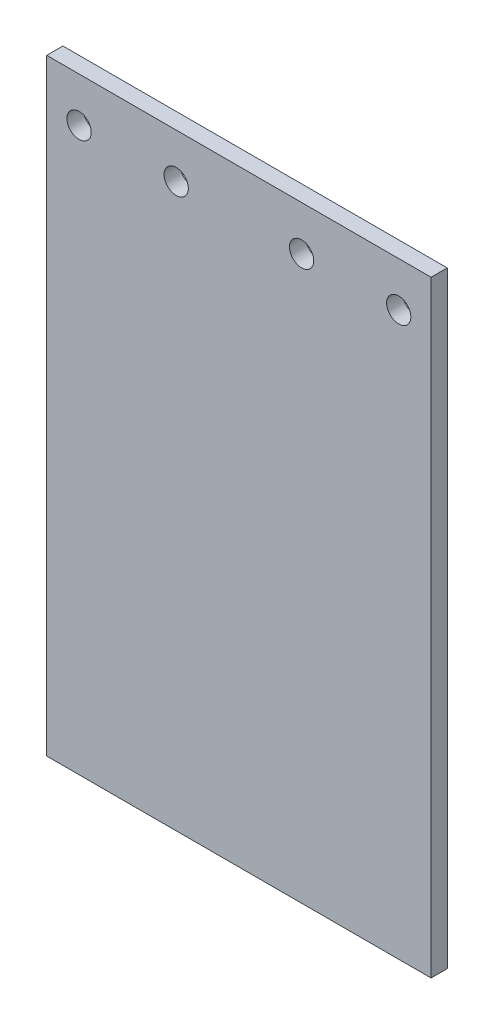
ISO-10303-21;
HEADER;
FILE_DESCRIPTION(('STEP AP214'),'2;1');
FILE_NAME('part.step','',(''),(''),'','','');
FILE_SCHEMA(('AUTOMOTIVE_DESIGN { 1 0 10303 214 1 1 1 1 }'));
ENDSEC;
DATA;
#1=APPLICATION_CONTEXT('core data for automotive mechanical design processes');
#2=APPLICATION_PROTOCOL_DEFINITION('international standard','automotive_design',2000,#1);
#3=PRODUCT_CONTEXT('',#1,'mechanical');
#4=PRODUCT('Part','Part','',(#3));
#5=PRODUCT_RELATED_PRODUCT_CATEGORY('part','',(#4));
#6=PRODUCT_DEFINITION_FORMATION('','',#4);
#7=PRODUCT_DEFINITION_CONTEXT('part definition',#1,'design');
#8=PRODUCT_DEFINITION('design','',#6,#7);
#9=PRODUCT_DEFINITION_SHAPE('','',#8);
#10=(LENGTH_UNIT() NAMED_UNIT(*) SI_UNIT(.MILLI.,.METRE.));
#11=(NAMED_UNIT(*) PLANE_ANGLE_UNIT() SI_UNIT($,.RADIAN.));
#12=(NAMED_UNIT(*) SI_UNIT($,.STERADIAN.) SOLID_ANGLE_UNIT());
#13=UNCERTAINTY_MEASURE_WITH_UNIT(LENGTH_MEASURE(1.E-05),#10,'distance_accuracy_value','');
#14=(GEOMETRIC_REPRESENTATION_CONTEXT(3) GLOBAL_UNCERTAINTY_ASSIGNED_CONTEXT((#13)) GLOBAL_UNIT_ASSIGNED_CONTEXT((#10,
#11,#12)) REPRESENTATION_CONTEXT('',''));
#15=CARTESIAN_POINT('',(0.,0.,0.));
#16=DIRECTION('',(0.,0.,1.));
#17=DIRECTION('',(1.,0.,0.));
#18=AXIS2_PLACEMENT_3D('',#15,#16,#17);
#19=CARTESIAN_POINT('',(47.5,-75.,4.));
#20=DIRECTION('',(-1.,0.,0.));
#21=DIRECTION('',(0.,0.,1.));
#22=AXIS2_PLACEMENT_3D('',#19,#20,#21);
#23=PLANE('',#22);
#24=DIRECTION('',(0.,1.,0.));
#25=VECTOR('',#24,1.);
#26=CARTESIAN_POINT('',(47.5,-75.,0.));
#27=LINE('',#26,#25);
#28=CARTESIAN_POINT('',(47.5,-75.,0.));
#29=VERTEX_POINT('',#28);
#30=CARTESIAN_POINT('',(47.5,75.,0.));
#31=VERTEX_POINT('',#30);
#32=EDGE_CURVE('E100',#29,#31,#27,.T.);
#33=ORIENTED_EDGE('',*,*,#32,.T.);
#34=DIRECTION('',(0.,0.,-1.));
#35=VECTOR('',#34,1.);
#36=CARTESIAN_POINT('',(47.5,75.,4.));
#37=LINE('',#36,#35);
#38=CARTESIAN_POINT('',(47.5,75.,4.));
#39=VERTEX_POINT('',#38);
#40=EDGE_CURVE('E11',#39,#31,#37,.T.);
#41=ORIENTED_EDGE('',*,*,#40,.F.);
#42=DIRECTION('',(0.,1.,0.));
#43=VECTOR('',#42,1.);
#44=CARTESIAN_POINT('',(47.5,-75.,4.));
#45=LINE('',#44,#43);
#46=CARTESIAN_POINT('',(47.5,-75.,4.));
#47=VERTEX_POINT('',#46);
#48=EDGE_CURVE('E88',#47,#39,#45,.T.);
#49=ORIENTED_EDGE('',*,*,#48,.F.);
#50=DIRECTION('',(0.,0.,-1.));
#51=VECTOR('',#50,1.);
#52=CARTESIAN_POINT('',(47.5,-75.,4.));
#53=LINE('',#52,#51);
#54=EDGE_CURVE('E96',#47,#29,#53,.T.);
#55=ORIENTED_EDGE('',*,*,#54,.T.);
#56=EDGE_LOOP('',(#33,#41,#49,#55));
#57=FACE_BOUND('',#56,.T.);
#58=ADVANCED_FACE('F37',(#57),#23,.F.);
#59=CARTESIAN_POINT('',(-47.5,75.,4.));
#60=DIRECTION('',(0.,-1.,0.));
#61=DIRECTION('',(0.,0.,-1.));
#62=AXIS2_PLACEMENT_3D('',#59,#60,#61);
#63=PLANE('',#62);
#64=DIRECTION('',(-1.,0.,0.));
#65=VECTOR('',#64,1.);
#66=CARTESIAN_POINT('',(-47.5,75.,0.));
#67=LINE('',#66,#65);
#68=CARTESIAN_POINT('',(-47.5,75.,0.));
#69=VERTEX_POINT('',#68);
#70=EDGE_CURVE('E92',#31,#69,#67,.T.);
#71=ORIENTED_EDGE('',*,*,#70,.T.);
#72=DIRECTION('',(0.,0.,-1.));
#73=VECTOR('',#72,1.);
#74=CARTESIAN_POINT('',(-47.5,75.,4.));
#75=LINE('',#74,#73);
#76=CARTESIAN_POINT('',(-47.5,75.,4.));
#77=VERTEX_POINT('',#76);
#78=EDGE_CURVE('E45',#77,#69,#75,.T.);
#79=ORIENTED_EDGE('',*,*,#78,.F.);
#80=DIRECTION('',(-1.,0.,0.));
#81=VECTOR('',#80,1.);
#82=CARTESIAN_POINT('',(-47.5,75.,4.));
#83=LINE('',#82,#81);
#84=EDGE_CURVE('E83',#39,#77,#83,.T.);
#85=ORIENTED_EDGE('',*,*,#84,.F.);
#86=ORIENTED_EDGE('',*,*,#40,.T.);
#87=EDGE_LOOP('',(#71,#79,#85,#86));
#88=FACE_BOUND('',#87,.T.);
#89=ADVANCED_FACE('F91',(#88),#63,.F.);
#90=CARTESIAN_POINT('',(-47.5,-75.,4.));
#91=DIRECTION('',(1.,0.,0.));
#92=DIRECTION('',(0.,0.,-1.));
#93=AXIS2_PLACEMENT_3D('',#90,#91,#92);
#94=PLANE('',#93);
#95=DIRECTION('',(0.,-1.,0.));
#96=VECTOR('',#95,1.);
#97=CARTESIAN_POINT('',(-47.5,-75.,0.));
#98=LINE('',#97,#96);
#99=CARTESIAN_POINT('',(-47.5,-75.,0.));
#100=VERTEX_POINT('',#99);
#101=EDGE_CURVE('E70',#69,#100,#98,.T.);
#102=ORIENTED_EDGE('',*,*,#101,.T.);
#103=DIRECTION('',(0.,0.,-1.));
#104=VECTOR('',#103,1.);
#105=CARTESIAN_POINT('',(-47.5,-75.,4.));
#106=LINE('',#105,#104);
#107=CARTESIAN_POINT('',(-47.5,-75.,4.));
#108=VERTEX_POINT('',#107);
#109=EDGE_CURVE('E93',#108,#100,#106,.T.);
#110=ORIENTED_EDGE('',*,*,#109,.F.);
#111=DIRECTION('',(0.,-1.,0.));
#112=VECTOR('',#111,1.);
#113=CARTESIAN_POINT('',(-47.5,-75.,4.));
#114=LINE('',#113,#112);
#115=EDGE_CURVE('E86',#77,#108,#114,.T.);
#116=ORIENTED_EDGE('',*,*,#115,.F.);
#117=ORIENTED_EDGE('',*,*,#78,.T.);
#118=EDGE_LOOP('',(#102,#110,#116,#117));
#119=FACE_BOUND('',#118,.T.);
#120=ADVANCED_FACE('F94',(#119),#94,.F.);
#121=CARTESIAN_POINT('',(-47.5,-75.,4.));
#122=DIRECTION('',(0.,1.,0.));
#123=DIRECTION('',(0.,0.,1.));
#124=AXIS2_PLACEMENT_3D('',#121,#122,#123);
#125=PLANE('',#124);
#126=DIRECTION('',(1.,0.,0.));
#127=VECTOR('',#126,1.);
#128=CARTESIAN_POINT('',(-47.5,-75.,0.));
#129=LINE('',#128,#127);
#130=EDGE_CURVE('E76',#100,#29,#129,.T.);
#131=ORIENTED_EDGE('',*,*,#130,.T.);
#132=ORIENTED_EDGE('',*,*,#54,.F.);
#133=DIRECTION('',(1.,0.,0.));
#134=VECTOR('',#133,1.);
#135=CARTESIAN_POINT('',(-47.5,-75.,4.));
#136=LINE('',#135,#134);
#137=EDGE_CURVE('E53',#108,#47,#136,.T.);
#138=ORIENTED_EDGE('',*,*,#137,.F.);
#139=ORIENTED_EDGE('',*,*,#109,.T.);
#140=EDGE_LOOP('',(#131,#132,#138,#139));
#141=FACE_BOUND('',#140,.T.);
#142=ADVANCED_FACE('F108',(#141),#125,.F.);
#143=CARTESIAN_POINT('',(0.,0.,4.));
#144=DIRECTION('',(0.,0.,-1.));
#145=DIRECTION('',(-1.,0.,0.));
#146=AXIS2_PLACEMENT_3D('',#143,#144,#145);
#147=PLANE('',#146);
#148=CARTESIAN_POINT('',(15.5,64.,4.));
#149=DIRECTION('',(0.,0.,-1.));
#150=DIRECTION('',(-1.,0.,0.));
#151=AXIS2_PLACEMENT_3D('',#148,#149,#150);
#152=CIRCLE('',#151,3.);
#153=CARTESIAN_POINT('',(12.5,64.,4.));
#154=VERTEX_POINT('',#153);
#155=EDGE_CURVE('E132',#154,#154,#152,.T.);
#156=ORIENTED_EDGE('',*,*,#155,.T.);
#157=EDGE_LOOP('',(#156));
#158=FACE_BOUND('',#157,.T.);
#159=CARTESIAN_POINT('',(39.5,64.,4.));
#160=DIRECTION('',(0.,0.,-1.));
#161=DIRECTION('',(-1.,0.,0.));
#162=AXIS2_PLACEMENT_3D('',#159,#160,#161);
#163=CIRCLE('',#162,3.);
#164=CARTESIAN_POINT('',(36.5,64.,4.));
#165=VERTEX_POINT('',#164);
#166=EDGE_CURVE('E126',#165,#165,#163,.T.);
#167=ORIENTED_EDGE('',*,*,#166,.T.);
#168=EDGE_LOOP('',(#167));
#169=FACE_BOUND('',#168,.T.);
#170=CARTESIAN_POINT('',(-15.5,64.,4.));
#171=DIRECTION('',(0.,0.,1.));
#172=DIRECTION('',(1.,0.,0.));
#173=AXIS2_PLACEMENT_3D('',#170,#171,#172);
#174=CIRCLE('',#173,3.);
#175=CARTESIAN_POINT('',(-12.5,64.,4.));
#176=VERTEX_POINT('',#175);
#177=EDGE_CURVE('E120',#176,#176,#174,.T.);
#178=ORIENTED_EDGE('',*,*,#177,.F.);
#179=EDGE_LOOP('',(#178));
#180=FACE_BOUND('',#179,.T.);
#181=CARTESIAN_POINT('',(-39.5,64.,4.));
#182=DIRECTION('',(0.,0.,1.));
#183=DIRECTION('',(1.,0.,0.));
#184=AXIS2_PLACEMENT_3D('',#181,#182,#183);
#185=CIRCLE('',#184,3.);
#186=CARTESIAN_POINT('',(-36.5,64.,4.));
#187=VERTEX_POINT('',#186);
#188=EDGE_CURVE('E114',#187,#187,#185,.T.);
#189=ORIENTED_EDGE('',*,*,#188,.F.);
#190=EDGE_LOOP('',(#189));
#191=FACE_BOUND('',#190,.T.);
#192=ORIENTED_EDGE('',*,*,#48,.T.);
#193=ORIENTED_EDGE('',*,*,#84,.T.);
#194=ORIENTED_EDGE('',*,*,#115,.T.);
#195=ORIENTED_EDGE('',*,*,#137,.T.);
#196=EDGE_LOOP('',(#192,#193,#194,#195));
#197=FACE_BOUND('',#196,.T.);
#198=ADVANCED_FACE('F84',(#158,#169,#180,#191,#197),#147,.F.);
#199=CARTESIAN_POINT('',(0.,0.,0.));
#200=DIRECTION('',(0.,0.,-1.));
#201=DIRECTION('',(-1.,0.,0.));
#202=AXIS2_PLACEMENT_3D('',#199,#200,#201);
#203=PLANE('',#202);
#204=CARTESIAN_POINT('',(15.5,64.,0.));
#205=DIRECTION('',(0.,0.,-1.));
#206=DIRECTION('',(-1.,0.,0.));
#207=AXIS2_PLACEMENT_3D('',#204,#205,#206);
#208=CIRCLE('',#207,3.);
#209=CARTESIAN_POINT('',(12.5,64.,0.));
#210=VERTEX_POINT('',#209);
#211=EDGE_CURVE('E129',#210,#210,#208,.T.);
#212=ORIENTED_EDGE('',*,*,#211,.F.);
#213=EDGE_LOOP('',(#212));
#214=FACE_BOUND('',#213,.T.);
#215=CARTESIAN_POINT('',(39.5,64.,0.));
#216=DIRECTION('',(0.,0.,-1.));
#217=DIRECTION('',(-1.,0.,0.));
#218=AXIS2_PLACEMENT_3D('',#215,#216,#217);
#219=CIRCLE('',#218,3.);
#220=CARTESIAN_POINT('',(36.5,64.,0.));
#221=VERTEX_POINT('',#220);
#222=EDGE_CURVE('E123',#221,#221,#219,.T.);
#223=ORIENTED_EDGE('',*,*,#222,.F.);
#224=EDGE_LOOP('',(#223));
#225=FACE_BOUND('',#224,.T.);
#226=CARTESIAN_POINT('',(-15.5,64.,0.));
#227=DIRECTION('',(0.,0.,1.));
#228=DIRECTION('',(1.,0.,0.));
#229=AXIS2_PLACEMENT_3D('',#226,#227,#228);
#230=CIRCLE('',#229,3.);
#231=CARTESIAN_POINT('',(-12.5,64.,0.));
#232=VERTEX_POINT('',#231);
#233=EDGE_CURVE('E117',#232,#232,#230,.T.);
#234=ORIENTED_EDGE('',*,*,#233,.T.);
#235=EDGE_LOOP('',(#234));
#236=FACE_BOUND('',#235,.T.);
#237=CARTESIAN_POINT('',(-39.5,64.,0.));
#238=DIRECTION('',(0.,0.,1.));
#239=DIRECTION('',(1.,0.,0.));
#240=AXIS2_PLACEMENT_3D('',#237,#238,#239);
#241=CIRCLE('',#240,3.);
#242=CARTESIAN_POINT('',(-36.5,64.,0.));
#243=VERTEX_POINT('',#242);
#244=EDGE_CURVE('E103',#243,#243,#241,.T.);
#245=ORIENTED_EDGE('',*,*,#244,.T.);
#246=EDGE_LOOP('',(#245));
#247=FACE_BOUND('',#246,.T.);
#248=ORIENTED_EDGE('',*,*,#32,.F.);
#249=ORIENTED_EDGE('',*,*,#130,.F.);
#250=ORIENTED_EDGE('',*,*,#101,.F.);
#251=ORIENTED_EDGE('',*,*,#70,.F.);
#252=EDGE_LOOP('',(#248,#249,#250,#251));
#253=FACE_BOUND('',#252,.T.);
#254=ADVANCED_FACE('F111',(#214,#225,#236,#247,#253),#203,.T.);
#255=CARTESIAN_POINT('',(-39.5,64.,0.));
#256=DIRECTION('',(0.,0.,1.));
#257=DIRECTION('',(1.,0.,0.));
#258=AXIS2_PLACEMENT_3D('',#255,#256,#257);
#259=CYLINDRICAL_SURFACE('',#258,3.);
#260=ORIENTED_EDGE('',*,*,#244,.F.);
#261=EDGE_LOOP('',(#260));
#262=FACE_BOUND('',#261,.T.);
#263=ORIENTED_EDGE('',*,*,#188,.T.);
#264=EDGE_LOOP('',(#263));
#265=FACE_BOUND('',#264,.T.);
#266=ADVANCED_FACE('F143',(#262,#265),#259,.F.);
#267=CARTESIAN_POINT('',(-15.5,64.,0.));
#268=DIRECTION('',(0.,0.,1.));
#269=DIRECTION('',(1.,0.,0.));
#270=AXIS2_PLACEMENT_3D('',#267,#268,#269);
#271=CYLINDRICAL_SURFACE('',#270,3.);
#272=ORIENTED_EDGE('',*,*,#233,.F.);
#273=EDGE_LOOP('',(#272));
#274=FACE_BOUND('',#273,.T.);
#275=ORIENTED_EDGE('',*,*,#177,.T.);
#276=EDGE_LOOP('',(#275));
#277=FACE_BOUND('',#276,.T.);
#278=ADVANCED_FACE('F153',(#274,#277),#271,.F.);
#279=CARTESIAN_POINT('',(39.5,64.,0.));
#280=DIRECTION('',(0.,0.,1.));
#281=DIRECTION('',(1.,0.,0.));
#282=AXIS2_PLACEMENT_3D('',#279,#280,#281);
#283=CYLINDRICAL_SURFACE('',#282,3.);
#284=ORIENTED_EDGE('',*,*,#222,.T.);
#285=EDGE_LOOP('',(#284));
#286=FACE_BOUND('',#285,.T.);
#287=ORIENTED_EDGE('',*,*,#166,.F.);
#288=EDGE_LOOP('',(#287));
#289=FACE_BOUND('',#288,.T.);
#290=ADVANCED_FACE('F195',(#286,#289),#283,.F.);
#291=CARTESIAN_POINT('',(15.5,64.,0.));
#292=DIRECTION('',(0.,0.,1.));
#293=DIRECTION('',(1.,0.,0.));
#294=AXIS2_PLACEMENT_3D('',#291,#292,#293);
#295=CYLINDRICAL_SURFACE('',#294,3.);
#296=ORIENTED_EDGE('',*,*,#211,.T.);
#297=EDGE_LOOP('',(#296));
#298=FACE_BOUND('',#297,.T.);
#299=ORIENTED_EDGE('',*,*,#155,.F.);
#300=EDGE_LOOP('',(#299));
#301=FACE_BOUND('',#300,.T.);
#302=ADVANCED_FACE('F138',(#298,#301),#295,.F.);
#303=CLOSED_SHELL('',(#58,#89,#120,#142,#198,#254,#266,#278,#290,#302));
#304=MANIFOLD_SOLID_BREP('B2',#303);
#305=ADVANCED_BREP_SHAPE_REPRESENTATION('',(#18,#304),#14);
#306=SHAPE_DEFINITION_REPRESENTATION(#9,#305);
ENDSEC;
END-ISO-10303-21;
